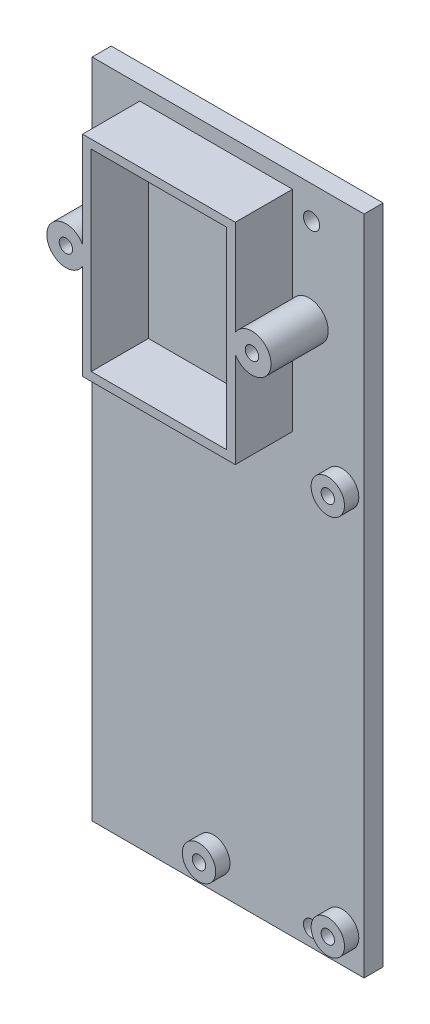
ISO-10303-21;
HEADER;
FILE_DESCRIPTION(('STEP AP214'),'2;1');
FILE_NAME('part.step','',(''),(''),'','','');
FILE_SCHEMA(('AUTOMOTIVE_DESIGN { 1 0 10303 214 1 1 1 1 }'));
ENDSEC;
DATA;
#1=APPLICATION_CONTEXT('core data for automotive mechanical design processes');
#2=APPLICATION_PROTOCOL_DEFINITION('international standard','automotive_design',2000,#1);
#3=PRODUCT_CONTEXT('',#1,'mechanical');
#4=PRODUCT('Part','Part','',(#3));
#5=PRODUCT_RELATED_PRODUCT_CATEGORY('part','',(#4));
#6=PRODUCT_DEFINITION_FORMATION('','',#4);
#7=PRODUCT_DEFINITION_CONTEXT('part definition',#1,'design');
#8=PRODUCT_DEFINITION('design','',#6,#7);
#9=PRODUCT_DEFINITION_SHAPE('','',#8);
#10=(LENGTH_UNIT() NAMED_UNIT(*) SI_UNIT(.MILLI.,.METRE.));
#11=(NAMED_UNIT(*) PLANE_ANGLE_UNIT() SI_UNIT($,.RADIAN.));
#12=(NAMED_UNIT(*) SI_UNIT($,.STERADIAN.) SOLID_ANGLE_UNIT());
#13=UNCERTAINTY_MEASURE_WITH_UNIT(LENGTH_MEASURE(1.E-05),#10,'distance_accuracy_value','');
#14=(GEOMETRIC_REPRESENTATION_CONTEXT(3) GLOBAL_UNCERTAINTY_ASSIGNED_CONTEXT((#13)) GLOBAL_UNIT_ASSIGNED_CONTEXT((#10,
#11,#12)) REPRESENTATION_CONTEXT('',''));
#15=CARTESIAN_POINT('',(0.,0.,0.));
#16=DIRECTION('',(0.,0.,1.));
#17=DIRECTION('',(1.,0.,0.));
#18=AXIS2_PLACEMENT_3D('',#15,#16,#17);
#19=CARTESIAN_POINT('',(-204.,-67.7,399.));
#20=DIRECTION('',(0.,1.,0.));
#21=DIRECTION('',(1.,0.,0.));
#22=AXIS2_PLACEMENT_3D('',#19,#20,#21);
#23=PLANE('',#22);
#24=DIRECTION('',(0.,0.,1.));
#25=VECTOR('',#24,1.);
#26=CARTESIAN_POINT('',(-147.,-67.7,399.));
#27=LINE('',#26,#25);
#28=CARTESIAN_POINT('',(-147.,-67.7,399.));
#29=VERTEX_POINT('',#28);
#30=CARTESIAN_POINT('',(-147.,-67.7,403.));
#31=VERTEX_POINT('',#30);
#32=EDGE_CURVE('E342',#29,#31,#27,.T.);
#33=ORIENTED_EDGE('',*,*,#32,.T.);
#34=DIRECTION('',(1.,0.,0.));
#35=VECTOR('',#34,1.);
#36=CARTESIAN_POINT('',(-204.,-67.7,403.));
#37=LINE('',#36,#35);
#38=CARTESIAN_POINT('',(-204.,-67.7,403.));
#39=VERTEX_POINT('',#38);
#40=EDGE_CURVE('E9',#39,#31,#37,.T.);
#41=ORIENTED_EDGE('',*,*,#40,.F.);
#42=DIRECTION('',(0.,0.,1.));
#43=VECTOR('',#42,1.);
#44=CARTESIAN_POINT('',(-204.,-67.7,399.));
#45=LINE('',#44,#43);
#46=CARTESIAN_POINT('',(-204.,-67.7,399.));
#47=VERTEX_POINT('',#46);
#48=EDGE_CURVE('E330',#47,#39,#45,.T.);
#49=ORIENTED_EDGE('',*,*,#48,.F.);
#50=DIRECTION('',(1.,0.,0.));
#51=VECTOR('',#50,1.);
#52=CARTESIAN_POINT('',(-204.,-67.7,399.));
#53=LINE('',#52,#51);
#54=EDGE_CURVE('E379',#47,#29,#53,.T.);
#55=ORIENTED_EDGE('',*,*,#54,.T.);
#56=EDGE_LOOP('',(#33,#41,#49,#55));
#57=FACE_BOUND('',#56,.T.);
#58=ADVANCED_FACE('F14',(#57),#23,.F.);
#59=CARTESIAN_POINT('',(-204.,-67.7,403.));
#60=DIRECTION('',(0.,0.,1.));
#61=DIRECTION('',(1.,0.,0.));
#62=AXIS2_PLACEMENT_3D('',#59,#60,#61);
#63=PLANE('',#62);
#64=CARTESIAN_POINT('',(-158.,64.2,403.));
#65=DIRECTION('',(0.,0.,1.));
#66=DIRECTION('',(1.,0.,0.));
#67=AXIS2_PLACEMENT_3D('',#64,#65,#66);
#68=CIRCLE('',#67,1.7);
#69=CARTESIAN_POINT('',(-156.3,64.2,403.));
#70=VERTEX_POINT('',#69);
#71=EDGE_CURVE('E361',#70,#70,#68,.T.);
#72=ORIENTED_EDGE('',*,*,#71,.F.);
#73=EDGE_LOOP('',(#72));
#74=FACE_BOUND('',#73,.T.);
#75=CARTESIAN_POINT('',(-151.6,19.,403.));
#76=DIRECTION('',(0.,0.,1.));
#77=DIRECTION('',(1.,0.,0.));
#78=AXIS2_PLACEMENT_3D('',#75,#76,#77);
#79=CIRCLE('',#78,3.5);
#80=CARTESIAN_POINT('',(-148.1,19.,403.));
#81=VERTEX_POINT('',#80);
#82=EDGE_CURVE('E475',#81,#81,#79,.T.);
#83=ORIENTED_EDGE('',*,*,#82,.F.);
#84=EDGE_LOOP('',(#83));
#85=FACE_BOUND('',#84,.T.);
#86=DIRECTION('',(0.,1.,0.));
#87=VECTOR('',#86,1.);
#88=CARTESIAN_POINT('',(-162.,-21.85,403.));
#89=LINE('',#88,#87);
#90=CARTESIAN_POINT('',(-162.,24.,403.));
#91=VERTEX_POINT('',#90);
#92=CARTESIAN_POINT('',(-162.,44.063508326896,403.));
#93=VERTEX_POINT('',#92);
#94=EDGE_CURVE('E482',#91,#93,#89,.T.);
#95=ORIENTED_EDGE('',*,*,#94,.F.);
#96=DIRECTION('',(-1.,0.,0.));
#97=VECTOR('',#96,1.);
#98=CARTESIAN_POINT('',(-199.,24.,403.));
#99=LINE('',#98,#97);
#100=CARTESIAN_POINT('',(-194.,24.,403.));
#101=VERTEX_POINT('',#100);
#102=EDGE_CURVE('E411',#91,#101,#99,.T.);
#103=ORIENTED_EDGE('',*,*,#102,.T.);
#104=DIRECTION('',(0.,1.,0.));
#105=VECTOR('',#104,1.);
#106=CARTESIAN_POINT('',(-194.,-21.85,403.));
#107=LINE('',#106,#105);
#108=CARTESIAN_POINT('',(-194.,44.063508326896,403.));
#109=VERTEX_POINT('',#108);
#110=EDGE_CURVE('E406',#101,#109,#107,.T.);
#111=ORIENTED_EDGE('',*,*,#110,.T.);
#112=CARTESIAN_POINT('',(-197.5,46.,403.));
#113=DIRECTION('',(0.,0.,1.));
#114=DIRECTION('',(1.,0.,0.));
#115=AXIS2_PLACEMENT_3D('',#112,#113,#114);
#116=CIRCLE('',#115,4.);
#117=CARTESIAN_POINT('',(-194.,47.936491673104,403.));
#118=VERTEX_POINT('',#117);
#119=EDGE_CURVE('E428',#118,#109,#116,.T.);
#120=ORIENTED_EDGE('',*,*,#119,.F.);
#121=DIRECTION('',(0.,1.,0.));
#122=VECTOR('',#121,1.);
#123=CARTESIAN_POINT('',(-194.,-21.85,403.));
#124=LINE('',#123,#122);
#125=CARTESIAN_POINT('',(-194.,68.,403.));
#126=VERTEX_POINT('',#125);
#127=EDGE_CURVE('E400',#118,#126,#124,.T.);
#128=ORIENTED_EDGE('',*,*,#127,.T.);
#129=DIRECTION('',(-1.,0.,0.));
#130=VECTOR('',#129,1.);
#131=CARTESIAN_POINT('',(-199.,68.,403.));
#132=LINE('',#131,#130);
#133=CARTESIAN_POINT('',(-162.,68.,403.));
#134=VERTEX_POINT('',#133);
#135=EDGE_CURVE('E291',#134,#126,#132,.T.);
#136=ORIENTED_EDGE('',*,*,#135,.F.);
#137=DIRECTION('',(0.,1.,0.));
#138=VECTOR('',#137,1.);
#139=CARTESIAN_POINT('',(-162.,-21.85,403.));
#140=LINE('',#139,#138);
#141=CARTESIAN_POINT('',(-162.,47.936491673104,403.));
#142=VERTEX_POINT('',#141);
#143=EDGE_CURVE('E363',#142,#134,#140,.T.);
#144=ORIENTED_EDGE('',*,*,#143,.F.);
#145=CARTESIAN_POINT('',(-158.5,46.,403.));
#146=DIRECTION('',(0.,0.,-1.));
#147=DIRECTION('',(-0.874999999999969,0.484122918275983,0.));
#148=AXIS2_PLACEMENT_3D('',#145,#146,#147);
#149=CIRCLE('',#148,4.);
#150=EDGE_CURVE('E414',#142,#93,#149,.T.);
#151=ORIENTED_EDGE('',*,*,#150,.T.);
#152=EDGE_LOOP('',(#95,#103,#111,#120,#128,#136,#144,#151));
#153=FACE_BOUND('',#152,.T.);
#154=CARTESIAN_POINT('',(-178.6,19.,403.));
#155=DIRECTION('',(0.,0.,1.));
#156=DIRECTION('',(1.,0.,0.));
#157=AXIS2_PLACEMENT_3D('',#154,#155,#156);
#158=CIRCLE('',#157,3.5);
#159=CARTESIAN_POINT('',(-175.1,19.,403.));
#160=VERTEX_POINT('',#159);
#161=EDGE_CURVE('E351',#160,#160,#158,.T.);
#162=ORIENTED_EDGE('',*,*,#161,.F.);
#163=EDGE_LOOP('',(#162));
#164=FACE_BOUND('',#163,.T.);
#165=CARTESIAN_POINT('',(-151.6,-61.,403.));
#166=DIRECTION('',(0.,0.,1.));
#167=DIRECTION('',(1.,0.,0.));
#168=AXIS2_PLACEMENT_3D('',#165,#166,#167);
#169=CIRCLE('',#168,3.5);
#170=CARTESIAN_POINT('',(-148.1,-61.,403.));
#171=VERTEX_POINT('',#170);
#172=EDGE_CURVE('E329',#171,#171,#169,.T.);
#173=ORIENTED_EDGE('',*,*,#172,.F.);
#174=EDGE_LOOP('',(#173));
#175=FACE_BOUND('',#174,.T.);
#176=CARTESIAN_POINT('',(-158.,-64.2,403.));
#177=DIRECTION('',(0.,0.,1.));
#178=DIRECTION('',(1.,0.,0.));
#179=AXIS2_PLACEMENT_3D('',#176,#177,#178);
#180=CIRCLE('',#179,1.7);
#181=CARTESIAN_POINT('',(-156.3,-64.2,403.));
#182=VERTEX_POINT('',#181);
#183=EDGE_CURVE('E328',#182,#182,#180,.T.);
#184=ORIENTED_EDGE('',*,*,#183,.F.);
#185=EDGE_LOOP('',(#184));
#186=FACE_BOUND('',#185,.T.);
#187=CARTESIAN_POINT('',(-178.6,-61.,403.));
#188=DIRECTION('',(0.,0.,1.));
#189=DIRECTION('',(1.,0.,0.));
#190=AXIS2_PLACEMENT_3D('',#187,#188,#189);
#191=CIRCLE('',#190,3.5);
#192=CARTESIAN_POINT('',(-175.1,-61.,403.));
#193=VERTEX_POINT('',#192);
#194=EDGE_CURVE('E497',#193,#193,#191,.T.);
#195=ORIENTED_EDGE('',*,*,#194,.F.);
#196=EDGE_LOOP('',(#195));
#197=FACE_BOUND('',#196,.T.);
#198=DIRECTION('',(0.,1.,0.));
#199=VECTOR('',#198,1.);
#200=CARTESIAN_POINT('',(-204.,-67.7,403.));
#201=LINE('',#200,#199);
#202=CARTESIAN_POINT('',(-204.,71.,403.));
#203=VERTEX_POINT('',#202);
#204=EDGE_CURVE('E352',#39,#203,#201,.T.);
#205=ORIENTED_EDGE('',*,*,#204,.F.);
#206=ORIENTED_EDGE('',*,*,#40,.T.);
#207=DIRECTION('',(0.,1.,0.));
#208=VECTOR('',#207,1.);
#209=CARTESIAN_POINT('',(-147.,-67.7,403.));
#210=LINE('',#209,#208);
#211=CARTESIAN_POINT('',(-147.,71.,403.));
#212=VERTEX_POINT('',#211);
#213=EDGE_CURVE('E302',#31,#212,#210,.T.);
#214=ORIENTED_EDGE('',*,*,#213,.T.);
#215=DIRECTION('',(1.,0.,0.));
#216=VECTOR('',#215,1.);
#217=CARTESIAN_POINT('',(-204.,71.,403.));
#218=LINE('',#217,#216);
#219=EDGE_CURVE('E25',#203,#212,#218,.T.);
#220=ORIENTED_EDGE('',*,*,#219,.F.);
#221=EDGE_LOOP('',(#205,#206,#214,#220));
#222=FACE_BOUND('',#221,.T.);
#223=ADVANCED_FACE('F596',(#74,#85,#153,#164,#175,#186,#197,#222),#63,.T.);
#224=CARTESIAN_POINT('',(-204.,71.,399.));
#225=DIRECTION('',(0.,1.,0.));
#226=DIRECTION('',(1.,0.,0.));
#227=AXIS2_PLACEMENT_3D('',#224,#225,#226);
#228=PLANE('',#227);
#229=DIRECTION('',(1.,0.,0.));
#230=VECTOR('',#229,1.);
#231=CARTESIAN_POINT('',(-204.,71.,399.));
#232=LINE('',#231,#230);
#233=CARTESIAN_POINT('',(-204.,71.,399.));
#234=VERTEX_POINT('',#233);
#235=CARTESIAN_POINT('',(-147.,71.,399.));
#236=VERTEX_POINT('',#235);
#237=EDGE_CURVE('E334',#234,#236,#232,.T.);
#238=ORIENTED_EDGE('',*,*,#237,.F.);
#239=DIRECTION('',(0.,0.,1.));
#240=VECTOR('',#239,1.);
#241=CARTESIAN_POINT('',(-204.,71.,399.));
#242=LINE('',#241,#240);
#243=EDGE_CURVE('E356',#234,#203,#242,.T.);
#244=ORIENTED_EDGE('',*,*,#243,.T.);
#245=ORIENTED_EDGE('',*,*,#219,.T.);
#246=DIRECTION('',(0.,0.,1.));
#247=VECTOR('',#246,1.);
#248=CARTESIAN_POINT('',(-147.,71.,399.));
#249=LINE('',#248,#247);
#250=EDGE_CURVE('E304',#236,#212,#249,.T.);
#251=ORIENTED_EDGE('',*,*,#250,.F.);
#252=EDGE_LOOP('',(#238,#244,#245,#251));
#253=FACE_BOUND('',#252,.T.);
#254=ADVANCED_FACE('F591',(#253),#228,.T.);
#255=CARTESIAN_POINT('',(-147.,-67.7,399.));
#256=DIRECTION('',(1.,0.,0.));
#257=DIRECTION('',(0.,1.,0.));
#258=AXIS2_PLACEMENT_3D('',#255,#256,#257);
#259=PLANE('',#258);
#260=ORIENTED_EDGE('',*,*,#32,.F.);
#261=DIRECTION('',(0.,1.,0.));
#262=VECTOR('',#261,1.);
#263=CARTESIAN_POINT('',(-147.,-67.7,399.));
#264=LINE('',#263,#262);
#265=EDGE_CURVE('E388',#29,#236,#264,.T.);
#266=ORIENTED_EDGE('',*,*,#265,.T.);
#267=ORIENTED_EDGE('',*,*,#250,.T.);
#268=ORIENTED_EDGE('',*,*,#213,.F.);
#269=EDGE_LOOP('',(#260,#266,#267,#268));
#270=FACE_BOUND('',#269,.T.);
#271=ADVANCED_FACE('F585',(#270),#259,.T.);
#272=CARTESIAN_POINT('',(-178.6,-61.,402.5));
#273=DIRECTION('',(0.,0.,1.));
#274=DIRECTION('',(1.,0.,0.));
#275=AXIS2_PLACEMENT_3D('',#272,#273,#274);
#276=CYLINDRICAL_SURFACE('',#275,3.5);
#277=DIRECTION('',(0.,0.,1.));
#278=VECTOR('',#277,1.);
#279=CARTESIAN_POINT('',(-175.1,-61.,402.5));
#280=LINE('',#279,#278);
#281=CARTESIAN_POINT('',(-175.1,-61.,406.));
#282=VERTEX_POINT('',#281);
#283=EDGE_CURVE('E458',#193,#282,#280,.T.);
#284=ORIENTED_EDGE('',*,*,#283,.T.);
#285=CARTESIAN_POINT('',(-178.6,-61.,406.));
#286=DIRECTION('',(0.,0.,1.));
#287=DIRECTION('',(1.,0.,0.));
#288=AXIS2_PLACEMENT_3D('',#285,#286,#287);
#289=CIRCLE('',#288,3.5);
#290=EDGE_CURVE('E455',#282,#282,#289,.T.);
#291=ORIENTED_EDGE('',*,*,#290,.F.);
#292=ORIENTED_EDGE('',*,*,#283,.F.);
#293=ORIENTED_EDGE('',*,*,#194,.T.);
#294=EDGE_LOOP('',(#284,#291,#292,#293));
#295=FACE_BOUND('',#294,.T.);
#296=ADVANCED_FACE('F581',(#295),#276,.T.);
#297=CARTESIAN_POINT('',(-178.6,-61.,406.));
#298=DIRECTION('',(0.,0.,1.));
#299=DIRECTION('',(1.,0.,0.));
#300=AXIS2_PLACEMENT_3D('',#297,#298,#299);
#301=PLANE('',#300);
#302=CARTESIAN_POINT('',(-178.6,-61.,406.));
#303=DIRECTION('',(0.,0.,1.));
#304=DIRECTION('',(1.,0.,0.));
#305=AXIS2_PLACEMENT_3D('',#302,#303,#304);
#306=CIRCLE('',#305,1.4);
#307=CARTESIAN_POINT('',(-177.2,-61.,406.));
#308=VERTEX_POINT('',#307);
#309=EDGE_CURVE('E459',#308,#308,#306,.T.);
#310=ORIENTED_EDGE('',*,*,#309,.F.);
#311=EDGE_LOOP('',(#310));
#312=FACE_BOUND('',#311,.T.);
#313=ORIENTED_EDGE('',*,*,#290,.T.);
#314=EDGE_LOOP('',(#313));
#315=FACE_BOUND('',#314,.T.);
#316=ADVANCED_FACE('F578',(#312,#315),#301,.T.);
#317=CARTESIAN_POINT('',(-178.6,-61.,398.9));
#318=DIRECTION('',(0.,0.,1.));
#319=DIRECTION('',(1.,0.,0.));
#320=AXIS2_PLACEMENT_3D('',#317,#318,#319);
#321=CYLINDRICAL_SURFACE('',#320,1.4);
#322=DIRECTION('',(0.,0.,1.));
#323=VECTOR('',#322,1.);
#324=CARTESIAN_POINT('',(-177.2,-61.,398.9));
#325=LINE('',#324,#323);
#326=CARTESIAN_POINT('',(-177.2,-61.,399.));
#327=VERTEX_POINT('',#326);
#328=EDGE_CURVE('E545',#327,#308,#325,.T.);
#329=ORIENTED_EDGE('',*,*,#328,.F.);
#330=CARTESIAN_POINT('',(-178.6,-61.,399.));
#331=DIRECTION('',(0.,0.,1.));
#332=DIRECTION('',(1.,0.,0.));
#333=AXIS2_PLACEMENT_3D('',#330,#331,#332);
#334=CIRCLE('',#333,1.4);
#335=EDGE_CURVE('E286',#327,#327,#334,.T.);
#336=ORIENTED_EDGE('',*,*,#335,.F.);
#337=ORIENTED_EDGE('',*,*,#328,.T.);
#338=ORIENTED_EDGE('',*,*,#309,.T.);
#339=EDGE_LOOP('',(#329,#336,#337,#338));
#340=FACE_BOUND('',#339,.T.);
#341=ADVANCED_FACE('F573',(#340),#321,.F.);
#342=CARTESIAN_POINT('',(-158.,-64.2,398.9));
#343=DIRECTION('',(0.,0.,1.));
#344=DIRECTION('',(1.,0.,0.));
#345=AXIS2_PLACEMENT_3D('',#342,#343,#344);
#346=CYLINDRICAL_SURFACE('',#345,1.7);
#347=DIRECTION('',(0.,0.,1.));
#348=VECTOR('',#347,1.);
#349=CARTESIAN_POINT('',(-156.3,-64.2,398.9));
#350=LINE('',#349,#348);
#351=CARTESIAN_POINT('',(-156.3,-64.2,399.));
#352=VERTEX_POINT('',#351);
#353=EDGE_CURVE('E324',#352,#182,#350,.T.);
#354=ORIENTED_EDGE('',*,*,#353,.F.);
#355=CARTESIAN_POINT('',(-158.,-64.2,399.));
#356=DIRECTION('',(0.,0.,1.));
#357=DIRECTION('',(1.,0.,0.));
#358=AXIS2_PLACEMENT_3D('',#355,#356,#357);
#359=CIRCLE('',#358,1.7);
#360=EDGE_CURVE('E281',#352,#352,#359,.T.);
#361=ORIENTED_EDGE('',*,*,#360,.F.);
#362=ORIENTED_EDGE('',*,*,#353,.T.);
#363=ORIENTED_EDGE('',*,*,#183,.T.);
#364=EDGE_LOOP('',(#354,#361,#362,#363));
#365=FACE_BOUND('',#364,.T.);
#366=ADVANCED_FACE('F629',(#365),#346,.F.);
#367=CARTESIAN_POINT('',(-151.6,-61.,402.5));
#368=DIRECTION('',(0.,0.,1.));
#369=DIRECTION('',(1.,0.,0.));
#370=AXIS2_PLACEMENT_3D('',#367,#368,#369);
#371=CYLINDRICAL_SURFACE('',#370,3.5);
#372=DIRECTION('',(0.,0.,1.));
#373=VECTOR('',#372,1.);
#374=CARTESIAN_POINT('',(-148.1,-61.,402.5));
#375=LINE('',#374,#373);
#376=CARTESIAN_POINT('',(-148.1,-61.,406.));
#377=VERTEX_POINT('',#376);
#378=EDGE_CURVE('E468',#171,#377,#375,.T.);
#379=ORIENTED_EDGE('',*,*,#378,.T.);
#380=CARTESIAN_POINT('',(-151.6,-61.,406.));
#381=DIRECTION('',(0.,0.,1.));
#382=DIRECTION('',(1.,0.,0.));
#383=AXIS2_PLACEMENT_3D('',#380,#381,#382);
#384=CIRCLE('',#383,3.5);
#385=EDGE_CURVE('E471',#377,#377,#384,.T.);
#386=ORIENTED_EDGE('',*,*,#385,.F.);
#387=ORIENTED_EDGE('',*,*,#378,.F.);
#388=ORIENTED_EDGE('',*,*,#172,.T.);
#389=EDGE_LOOP('',(#379,#386,#387,#388));
#390=FACE_BOUND('',#389,.T.);
#391=ADVANCED_FACE('F783',(#390),#371,.T.);
#392=CARTESIAN_POINT('',(-151.6,-61.,406.));
#393=DIRECTION('',(0.,0.,1.));
#394=DIRECTION('',(1.,0.,0.));
#395=AXIS2_PLACEMENT_3D('',#392,#393,#394);
#396=PLANE('',#395);
#397=CARTESIAN_POINT('',(-151.6,-61.,406.));
#398=DIRECTION('',(0.,0.,1.));
#399=DIRECTION('',(1.,0.,0.));
#400=AXIS2_PLACEMENT_3D('',#397,#398,#399);
#401=CIRCLE('',#400,1.4);
#402=CARTESIAN_POINT('',(-150.2,-61.,406.));
#403=VERTEX_POINT('',#402);
#404=EDGE_CURVE('E350',#403,#403,#401,.T.);
#405=ORIENTED_EDGE('',*,*,#404,.F.);
#406=EDGE_LOOP('',(#405));
#407=FACE_BOUND('',#406,.T.);
#408=ORIENTED_EDGE('',*,*,#385,.T.);
#409=EDGE_LOOP('',(#408));
#410=FACE_BOUND('',#409,.T.);
#411=ADVANCED_FACE('F16',(#407,#410),#396,.T.);
#412=CARTESIAN_POINT('',(-151.6,-61.,398.9));
#413=DIRECTION('',(0.,0.,1.));
#414=DIRECTION('',(1.,0.,0.));
#415=AXIS2_PLACEMENT_3D('',#412,#413,#414);
#416=CYLINDRICAL_SURFACE('',#415,1.4);
#417=DIRECTION('',(0.,0.,1.));
#418=VECTOR('',#417,1.);
#419=CARTESIAN_POINT('',(-150.2,-61.,398.9));
#420=LINE('',#419,#418);
#421=CARTESIAN_POINT('',(-150.2,-61.,399.));
#422=VERTEX_POINT('',#421);
#423=EDGE_CURVE('E346',#422,#403,#420,.T.);
#424=ORIENTED_EDGE('',*,*,#423,.F.);
#425=CARTESIAN_POINT('',(-151.6,-61.,399.));
#426=DIRECTION('',(0.,0.,1.));
#427=DIRECTION('',(1.,0.,0.));
#428=AXIS2_PLACEMENT_3D('',#425,#426,#427);
#429=CIRCLE('',#428,1.4);
#430=EDGE_CURVE('E285',#422,#422,#429,.T.);
#431=ORIENTED_EDGE('',*,*,#430,.F.);
#432=ORIENTED_EDGE('',*,*,#423,.T.);
#433=ORIENTED_EDGE('',*,*,#404,.T.);
#434=EDGE_LOOP('',(#424,#431,#432,#433));
#435=FACE_BOUND('',#434,.T.);
#436=ADVANCED_FACE('F774',(#435),#416,.F.);
#437=CARTESIAN_POINT('',(-178.6,19.,402.5));
#438=DIRECTION('',(0.,0.,1.));
#439=DIRECTION('',(1.,0.,0.));
#440=AXIS2_PLACEMENT_3D('',#437,#438,#439);
#441=CYLINDRICAL_SURFACE('',#440,3.5);
#442=DIRECTION('',(0.,0.,1.));
#443=VECTOR('',#442,1.);
#444=CARTESIAN_POINT('',(-175.1,19.,402.5));
#445=LINE('',#444,#443);
#446=CARTESIAN_POINT('',(-175.1,19.,406.));
#447=VERTEX_POINT('',#446);
#448=EDGE_CURVE('E438',#160,#447,#445,.T.);
#449=ORIENTED_EDGE('',*,*,#448,.T.);
#450=CARTESIAN_POINT('',(-178.6,19.,406.));
#451=DIRECTION('',(0.,0.,1.));
#452=DIRECTION('',(1.,0.,0.));
#453=AXIS2_PLACEMENT_3D('',#450,#451,#452);
#454=CIRCLE('',#453,3.5);
#455=EDGE_CURVE('E435',#447,#447,#454,.T.);
#456=ORIENTED_EDGE('',*,*,#455,.F.);
#457=ORIENTED_EDGE('',*,*,#448,.F.);
#458=ORIENTED_EDGE('',*,*,#161,.T.);
#459=EDGE_LOOP('',(#449,#456,#457,#458));
#460=FACE_BOUND('',#459,.T.);
#461=ADVANCED_FACE('F771',(#460),#441,.T.);
#462=CARTESIAN_POINT('',(-178.6,19.,406.));
#463=DIRECTION('',(0.,0.,1.));
#464=DIRECTION('',(1.,0.,0.));
#465=AXIS2_PLACEMENT_3D('',#462,#463,#464);
#466=PLANE('',#465);
#467=CARTESIAN_POINT('',(-178.6,19.,406.));
#468=DIRECTION('',(0.,0.,1.));
#469=DIRECTION('',(1.,0.,0.));
#470=AXIS2_PLACEMENT_3D('',#467,#468,#469);
#471=CIRCLE('',#470,1.4);
#472=CARTESIAN_POINT('',(-177.2,19.,406.));
#473=VERTEX_POINT('',#472);
#474=EDGE_CURVE('E439',#473,#473,#471,.T.);
#475=ORIENTED_EDGE('',*,*,#474,.F.);
#476=EDGE_LOOP('',(#475));
#477=FACE_BOUND('',#476,.T.);
#478=ORIENTED_EDGE('',*,*,#455,.T.);
#479=EDGE_LOOP('',(#478));
#480=FACE_BOUND('',#479,.T.);
#481=ADVANCED_FACE('F661',(#477,#480),#466,.T.);
#482=CARTESIAN_POINT('',(-178.6,19.,398.9));
#483=DIRECTION('',(0.,0.,1.));
#484=DIRECTION('',(1.,0.,0.));
#485=AXIS2_PLACEMENT_3D('',#482,#483,#484);
#486=CYLINDRICAL_SURFACE('',#485,1.4);
#487=DIRECTION('',(0.,0.,1.));
#488=VECTOR('',#487,1.);
#489=CARTESIAN_POINT('',(-177.2,19.,398.9));
#490=LINE('',#489,#488);
#491=CARTESIAN_POINT('',(-177.2,19.,399.));
#492=VERTEX_POINT('',#491);
#493=EDGE_CURVE('E18',#492,#473,#490,.T.);
#494=ORIENTED_EDGE('',*,*,#493,.F.);
#495=CARTESIAN_POINT('',(-178.6,19.,399.));
#496=DIRECTION('',(0.,0.,1.));
#497=DIRECTION('',(1.,0.,0.));
#498=AXIS2_PLACEMENT_3D('',#495,#496,#497);
#499=CIRCLE('',#498,1.4);
#500=EDGE_CURVE('E314',#492,#492,#499,.T.);
#501=ORIENTED_EDGE('',*,*,#500,.F.);
#502=ORIENTED_EDGE('',*,*,#493,.T.);
#503=ORIENTED_EDGE('',*,*,#474,.T.);
#504=EDGE_LOOP('',(#494,#501,#502,#503));
#505=FACE_BOUND('',#504,.T.);
#506=ADVANCED_FACE('F654',(#505),#486,.F.);
#507=CARTESIAN_POINT('',(-197.5,46.,407.05));
#508=DIRECTION('',(0.,0.,-1.));
#509=DIRECTION('',(-1.,0.,0.));
#510=AXIS2_PLACEMENT_3D('',#507,#508,#509);
#511=CYLINDRICAL_SURFACE('',#510,1.4);
#512=DIRECTION('',(0.,0.,-1.));
#513=VECTOR('',#512,1.);
#514=CARTESIAN_POINT('',(-198.9,46.,407.05));
#515=LINE('',#514,#513);
#516=CARTESIAN_POINT('',(-198.9,46.,406.9));
#517=VERTEX_POINT('',#516);
#518=CARTESIAN_POINT('',(-198.9,46.,399.));
#519=VERTEX_POINT('',#518);
#520=EDGE_CURVE('E301',#517,#519,#515,.T.);
#521=ORIENTED_EDGE('',*,*,#520,.F.);
#522=CARTESIAN_POINT('',(-197.5,46.,406.9));
#523=DIRECTION('',(0.,0.,1.));
#524=DIRECTION('',(1.,0.,0.));
#525=AXIS2_PLACEMENT_3D('',#522,#523,#524);
#526=CIRCLE('',#525,1.4);
#527=CARTESIAN_POINT('',(-196.1,46.,406.9));
#528=VERTEX_POINT('',#527);
#529=EDGE_CURVE('E297',#528,#517,#526,.T.);
#530=ORIENTED_EDGE('',*,*,#529,.F.);
#531=DIRECTION('',(0.,0.,-1.));
#532=VECTOR('',#531,1.);
#533=CARTESIAN_POINT('',(-196.1,46.,415.));
#534=LINE('',#533,#532);
#535=CARTESIAN_POINT('',(-196.1,46.,415.));
#536=VERTEX_POINT('',#535);
#537=EDGE_CURVE('E300',#536,#528,#534,.T.);
#538=ORIENTED_EDGE('',*,*,#537,.F.);
#539=CARTESIAN_POINT('',(-197.5,46.,415.));
#540=DIRECTION('',(0.,0.,1.));
#541=DIRECTION('',(1.,0.,0.));
#542=AXIS2_PLACEMENT_3D('',#539,#540,#541);
#543=CIRCLE('',#542,1.4);
#544=EDGE_CURVE('E308',#536,#536,#543,.T.);
#545=ORIENTED_EDGE('',*,*,#544,.T.);
#546=ORIENTED_EDGE('',*,*,#537,.T.);
#547=ORIENTED_EDGE('',*,*,#529,.T.);
#548=ORIENTED_EDGE('',*,*,#520,.T.);
#549=CARTESIAN_POINT('',(-197.5,46.,399.));
#550=DIRECTION('',(0.,0.,-1.));
#551=DIRECTION('',(-1.,0.,0.));
#552=AXIS2_PLACEMENT_3D('',#549,#550,#551);
#553=CIRCLE('',#552,1.4);
#554=EDGE_CURVE('E309',#519,#519,#553,.T.);
#555=ORIENTED_EDGE('',*,*,#554,.T.);
#556=EDGE_LOOP('',(#521,#530,#538,#545,#546,#547,#548,#555));
#557=FACE_BOUND('',#556,.T.);
#558=ADVANCED_FACE('F651',(#557),#511,.F.);
#559=CARTESIAN_POINT('',(-151.6,19.,402.5));
#560=DIRECTION('',(0.,0.,1.));
#561=DIRECTION('',(1.,0.,0.));
#562=AXIS2_PLACEMENT_3D('',#559,#560,#561);
#563=CYLINDRICAL_SURFACE('',#562,3.5);
#564=DIRECTION('',(0.,0.,1.));
#565=VECTOR('',#564,1.);
#566=CARTESIAN_POINT('',(-148.1,19.,402.5));
#567=LINE('',#566,#565);
#568=CARTESIAN_POINT('',(-148.1,19.,406.));
#569=VERTEX_POINT('',#568);
#570=EDGE_CURVE('E418',#81,#569,#567,.T.);
#571=ORIENTED_EDGE('',*,*,#570,.T.);
#572=CARTESIAN_POINT('',(-151.6,19.,406.));
#573=DIRECTION('',(0.,0.,1.));
#574=DIRECTION('',(1.,0.,0.));
#575=AXIS2_PLACEMENT_3D('',#572,#573,#574);
#576=CIRCLE('',#575,3.5);
#577=EDGE_CURVE('E415',#569,#569,#576,.T.);
#578=ORIENTED_EDGE('',*,*,#577,.F.);
#579=ORIENTED_EDGE('',*,*,#570,.F.);
#580=ORIENTED_EDGE('',*,*,#82,.T.);
#581=EDGE_LOOP('',(#571,#578,#579,#580));
#582=FACE_BOUND('',#581,.T.);
#583=ADVANCED_FACE('F620',(#582),#563,.T.);
#584=CARTESIAN_POINT('',(-151.6,19.,406.));
#585=DIRECTION('',(0.,0.,1.));
#586=DIRECTION('',(1.,0.,0.));
#587=AXIS2_PLACEMENT_3D('',#584,#585,#586);
#588=PLANE('',#587);
#589=CARTESIAN_POINT('',(-151.6,19.,406.));
#590=DIRECTION('',(0.,0.,1.));
#591=DIRECTION('',(1.,0.,0.));
#592=AXIS2_PLACEMENT_3D('',#589,#590,#591);
#593=CIRCLE('',#592,1.4);
#594=CARTESIAN_POINT('',(-150.2,19.,406.));
#595=VERTEX_POINT('',#594);
#596=EDGE_CURVE('E419',#595,#595,#593,.T.);
#597=ORIENTED_EDGE('',*,*,#596,.F.);
#598=EDGE_LOOP('',(#597));
#599=FACE_BOUND('',#598,.T.);
#600=ORIENTED_EDGE('',*,*,#577,.T.);
#601=EDGE_LOOP('',(#600));
#602=FACE_BOUND('',#601,.T.);
#603=ADVANCED_FACE('F617',(#599,#602),#588,.T.);
#604=CARTESIAN_POINT('',(-151.6,19.,398.9));
#605=DIRECTION('',(0.,0.,1.));
#606=DIRECTION('',(1.,0.,0.));
#607=AXIS2_PLACEMENT_3D('',#604,#605,#606);
#608=CYLINDRICAL_SURFACE('',#607,1.4);
#609=DIRECTION('',(0.,0.,1.));
#610=VECTOR('',#609,1.);
#611=CARTESIAN_POINT('',(-150.2,19.,398.9));
#612=LINE('',#611,#610);
#613=CARTESIAN_POINT('',(-150.2,19.,399.));
#614=VERTEX_POINT('',#613);
#615=EDGE_CURVE('E410',#614,#595,#612,.T.);
#616=ORIENTED_EDGE('',*,*,#615,.F.);
#617=CARTESIAN_POINT('',(-151.6,19.,399.));
#618=DIRECTION('',(0.,0.,1.));
#619=DIRECTION('',(1.,0.,0.));
#620=AXIS2_PLACEMENT_3D('',#617,#618,#619);
#621=CIRCLE('',#620,1.4);
#622=EDGE_CURVE('E313',#614,#614,#621,.T.);
#623=ORIENTED_EDGE('',*,*,#622,.F.);
#624=ORIENTED_EDGE('',*,*,#615,.T.);
#625=ORIENTED_EDGE('',*,*,#596,.T.);
#626=EDGE_LOOP('',(#616,#623,#624,#625));
#627=FACE_BOUND('',#626,.T.);
#628=ADVANCED_FACE('F605',(#627),#608,.F.);
#629=CARTESIAN_POINT('',(-194.,24.,402.5));
#630=DIRECTION('',(1.,0.,0.));
#631=DIRECTION('',(0.,1.,0.));
#632=AXIS2_PLACEMENT_3D('',#629,#630,#631);
#633=PLANE('',#632);
#634=DIRECTION('',(0.,1.,0.));
#635=VECTOR('',#634,1.);
#636=CARTESIAN_POINT('',(-194.,24.,415.));
#637=LINE('',#636,#635);
#638=CARTESIAN_POINT('',(-194.,24.,415.));
#639=VERTEX_POINT('',#638);
#640=CARTESIAN_POINT('',(-194.,44.063508326896,415.));
#641=VERTEX_POINT('',#640);
#642=EDGE_CURVE('E323',#639,#641,#637,.T.);
#643=ORIENTED_EDGE('',*,*,#642,.T.);
#644=DIRECTION('',(0.,0.,1.));
#645=VECTOR('',#644,1.);
#646=CARTESIAN_POINT('',(-194.,44.063508326896,402.5));
#647=LINE('',#646,#645);
#648=EDGE_CURVE('E135',#109,#641,#647,.T.);
#649=ORIENTED_EDGE('',*,*,#648,.F.);
#650=ORIENTED_EDGE('',*,*,#110,.F.);
#651=DIRECTION('',(0.,0.,1.));
#652=VECTOR('',#651,1.);
#653=CARTESIAN_POINT('',(-194.,24.,402.5));
#654=LINE('',#653,#652);
#655=EDGE_CURVE('E147',#101,#639,#654,.T.);
#656=ORIENTED_EDGE('',*,*,#655,.T.);
#657=EDGE_LOOP('',(#643,#649,#650,#656));
#658=FACE_BOUND('',#657,.T.);
#659=ADVANCED_FACE('F686',(#658),#633,.F.);
#660=CARTESIAN_POINT('',(-194.,24.,402.5));
#661=DIRECTION('',(0.,1.,0.));
#662=DIRECTION('',(1.,0.,0.));
#663=AXIS2_PLACEMENT_3D('',#660,#661,#662);
#664=PLANE('',#663);
#665=DIRECTION('',(1.,0.,0.));
#666=VECTOR('',#665,1.);
#667=CARTESIAN_POINT('',(-194.,24.,415.));
#668=LINE('',#667,#666);
#669=CARTESIAN_POINT('',(-162.,24.,415.));
#670=VERTEX_POINT('',#669);
#671=EDGE_CURVE('E280',#639,#670,#668,.T.);
#672=ORIENTED_EDGE('',*,*,#671,.F.);
#673=ORIENTED_EDGE('',*,*,#655,.F.);
#674=ORIENTED_EDGE('',*,*,#102,.F.);
#675=DIRECTION('',(0.,0.,1.));
#676=VECTOR('',#675,1.);
#677=CARTESIAN_POINT('',(-162.,24.,402.5));
#678=LINE('',#677,#676);
#679=EDGE_CURVE('E566',#91,#670,#678,.T.);
#680=ORIENTED_EDGE('',*,*,#679,.T.);
#681=EDGE_LOOP('',(#672,#673,#674,#680));
#682=FACE_BOUND('',#681,.T.);
#683=ADVANCED_FACE('F646',(#682),#664,.F.);
#684=CARTESIAN_POINT('',(-197.5,46.,402.5));
#685=DIRECTION('',(0.,0.,1.));
#686=DIRECTION('',(1.,0.,0.));
#687=AXIS2_PLACEMENT_3D('',#684,#685,#686);
#688=CYLINDRICAL_SURFACE('',#687,4.);
#689=CARTESIAN_POINT('',(-197.5,46.,415.));
#690=DIRECTION('',(0.,0.,1.));
#691=DIRECTION('',(1.,0.,0.));
#692=AXIS2_PLACEMENT_3D('',#689,#690,#691);
#693=CIRCLE('',#692,4.);
#694=CARTESIAN_POINT('',(-194.,47.936491673104,415.));
#695=VERTEX_POINT('',#694);
#696=EDGE_CURVE('E392',#695,#641,#693,.T.);
#697=ORIENTED_EDGE('',*,*,#696,.F.);
#698=DIRECTION('',(0.,0.,1.));
#699=VECTOR('',#698,1.);
#700=CARTESIAN_POINT('',(-194.,47.936491673104,402.5));
#701=LINE('',#700,#699);
#702=EDGE_CURVE('E404',#118,#695,#701,.T.);
#703=ORIENTED_EDGE('',*,*,#702,.F.);
#704=ORIENTED_EDGE('',*,*,#119,.T.);
#705=ORIENTED_EDGE('',*,*,#648,.T.);
#706=EDGE_LOOP('',(#697,#703,#704,#705));
#707=FACE_BOUND('',#706,.T.);
#708=ADVANCED_FACE('F642',(#707),#688,.T.);
#709=CARTESIAN_POINT('',(-162.,24.,402.5));
#710=DIRECTION('',(1.,0.,0.));
#711=DIRECTION('',(0.,1.,0.));
#712=AXIS2_PLACEMENT_3D('',#709,#710,#711);
#713=PLANE('',#712);
#714=ORIENTED_EDGE('',*,*,#679,.F.);
#715=ORIENTED_EDGE('',*,*,#94,.T.);
#716=DIRECTION('',(0.,0.,1.));
#717=VECTOR('',#716,1.);
#718=CARTESIAN_POINT('',(-162.,44.063508326896,402.5));
#719=LINE('',#718,#717);
#720=CARTESIAN_POINT('',(-162.,44.063508326896,415.));
#721=VERTEX_POINT('',#720);
#722=EDGE_CURVE('E405',#93,#721,#719,.T.);
#723=ORIENTED_EDGE('',*,*,#722,.T.);
#724=DIRECTION('',(0.,1.,0.));
#725=VECTOR('',#724,1.);
#726=CARTESIAN_POINT('',(-162.,24.,415.));
#727=LINE('',#726,#725);
#728=EDGE_CURVE('E276',#670,#721,#727,.T.);
#729=ORIENTED_EDGE('',*,*,#728,.F.);
#730=EDGE_LOOP('',(#714,#715,#723,#729));
#731=FACE_BOUND('',#730,.T.);
#732=ADVANCED_FACE('F639',(#731),#713,.T.);
#733=CARTESIAN_POINT('',(-194.,24.,402.5));
#734=DIRECTION('',(1.,0.,0.));
#735=DIRECTION('',(0.,1.,0.));
#736=AXIS2_PLACEMENT_3D('',#733,#734,#735);
#737=PLANE('',#736);
#738=DIRECTION('',(0.,1.,0.));
#739=VECTOR('',#738,1.);
#740=CARTESIAN_POINT('',(-194.,24.,415.));
#741=LINE('',#740,#739);
#742=CARTESIAN_POINT('',(-194.,68.,415.));
#743=VERTEX_POINT('',#742);
#744=EDGE_CURVE('E395',#695,#743,#741,.T.);
#745=ORIENTED_EDGE('',*,*,#744,.T.);
#746=DIRECTION('',(0.,0.,1.));
#747=VECTOR('',#746,1.);
#748=CARTESIAN_POINT('',(-194.,68.,402.5));
#749=LINE('',#748,#747);
#750=EDGE_CURVE('E295',#126,#743,#749,.T.);
#751=ORIENTED_EDGE('',*,*,#750,.F.);
#752=ORIENTED_EDGE('',*,*,#127,.F.);
#753=ORIENTED_EDGE('',*,*,#702,.T.);
#754=EDGE_LOOP('',(#745,#751,#752,#753));
#755=FACE_BOUND('',#754,.T.);
#756=ADVANCED_FACE('F520',(#755),#737,.F.);
#757=CARTESIAN_POINT('',(-158.5,46.,402.5));
#758=DIRECTION('',(0.,0.,1.));
#759=DIRECTION('',(1.,0.,0.));
#760=AXIS2_PLACEMENT_3D('',#757,#758,#759);
#761=CYLINDRICAL_SURFACE('',#760,4.);
#762=ORIENTED_EDGE('',*,*,#150,.F.);
#763=DIRECTION('',(0.,0.,1.));
#764=VECTOR('',#763,1.);
#765=CARTESIAN_POINT('',(-162.,47.936491673104,402.5));
#766=LINE('',#765,#764);
#767=CARTESIAN_POINT('',(-162.,47.936491673104,415.));
#768=VERTEX_POINT('',#767);
#769=EDGE_CURVE('E367',#142,#768,#766,.T.);
#770=ORIENTED_EDGE('',*,*,#769,.T.);
#771=CARTESIAN_POINT('',(-158.5,46.,415.));
#772=DIRECTION('',(0.,0.,-1.));
#773=DIRECTION('',(-0.874999999999969,0.484122918275983,0.));
#774=AXIS2_PLACEMENT_3D('',#771,#772,#773);
#775=CIRCLE('',#774,4.);
#776=EDGE_CURVE('E279',#768,#721,#775,.T.);
#777=ORIENTED_EDGE('',*,*,#776,.T.);
#778=ORIENTED_EDGE('',*,*,#722,.F.);
#779=EDGE_LOOP('',(#762,#770,#777,#778));
#780=FACE_BOUND('',#779,.T.);
#781=ADVANCED_FACE('F663',(#780),#761,.T.);
#782=CARTESIAN_POINT('',(-194.,68.,402.5));
#783=DIRECTION('',(0.,1.,0.));
#784=DIRECTION('',(1.,0.,0.));
#785=AXIS2_PLACEMENT_3D('',#782,#783,#784);
#786=PLANE('',#785);
#787=DIRECTION('',(0.,0.,1.));
#788=VECTOR('',#787,1.);
#789=CARTESIAN_POINT('',(-162.,68.,402.5));
#790=LINE('',#789,#788);
#791=CARTESIAN_POINT('',(-162.,68.,415.));
#792=VERTEX_POINT('',#791);
#793=EDGE_CURVE('E296',#134,#792,#790,.T.);
#794=ORIENTED_EDGE('',*,*,#793,.F.);
#795=ORIENTED_EDGE('',*,*,#135,.T.);
#796=ORIENTED_EDGE('',*,*,#750,.T.);
#797=DIRECTION('',(1.,0.,0.));
#798=VECTOR('',#797,1.);
#799=CARTESIAN_POINT('',(-194.,68.,415.));
#800=LINE('',#799,#798);
#801=EDGE_CURVE('E463',#743,#792,#800,.T.);
#802=ORIENTED_EDGE('',*,*,#801,.T.);
#803=EDGE_LOOP('',(#794,#795,#796,#802));
#804=FACE_BOUND('',#803,.T.);
#805=ADVANCED_FACE('F530',(#804),#786,.T.);
#806=CARTESIAN_POINT('',(-162.,24.,402.5));
#807=DIRECTION('',(1.,0.,0.));
#808=DIRECTION('',(0.,1.,0.));
#809=AXIS2_PLACEMENT_3D('',#806,#807,#808);
#810=PLANE('',#809);
#811=ORIENTED_EDGE('',*,*,#769,.F.);
#812=ORIENTED_EDGE('',*,*,#143,.T.);
#813=ORIENTED_EDGE('',*,*,#793,.T.);
#814=DIRECTION('',(0.,1.,0.));
#815=VECTOR('',#814,1.);
#816=CARTESIAN_POINT('',(-162.,24.,415.));
#817=LINE('',#816,#815);
#818=EDGE_CURVE('E290',#768,#792,#817,.T.);
#819=ORIENTED_EDGE('',*,*,#818,.F.);
#820=EDGE_LOOP('',(#811,#812,#813,#819));
#821=FACE_BOUND('',#820,.T.);
#822=ADVANCED_FACE('F615',(#821),#810,.T.);
#823=CARTESIAN_POINT('',(-192.2,25.8,403.));
#824=DIRECTION('',(0.,1.,0.));
#825=DIRECTION('',(1.,0.,0.));
#826=AXIS2_PLACEMENT_3D('',#823,#824,#825);
#827=PLANE('',#826);
#828=DIRECTION('',(0.,0.,1.));
#829=VECTOR('',#828,1.);
#830=CARTESIAN_POINT('',(-163.8,25.8,403.));
#831=LINE('',#830,#829);
#832=CARTESIAN_POINT('',(-163.8,25.8,403.));
#833=VERTEX_POINT('',#832);
#834=CARTESIAN_POINT('',(-163.8,25.8,415.));
#835=VERTEX_POINT('',#834);
#836=EDGE_CURVE('E254',#833,#835,#831,.T.);
#837=ORIENTED_EDGE('',*,*,#836,.F.);
#838=DIRECTION('',(1.,0.,0.));
#839=VECTOR('',#838,1.);
#840=CARTESIAN_POINT('',(-192.2,25.8,403.));
#841=LINE('',#840,#839);
#842=CARTESIAN_POINT('',(-192.2,25.8,403.));
#843=VERTEX_POINT('',#842);
#844=EDGE_CURVE('E380',#843,#833,#841,.T.);
#845=ORIENTED_EDGE('',*,*,#844,.F.);
#846=DIRECTION('',(0.,0.,1.));
#847=VECTOR('',#846,1.);
#848=CARTESIAN_POINT('',(-192.2,25.8,403.));
#849=LINE('',#848,#847);
#850=CARTESIAN_POINT('',(-192.2,25.8,415.));
#851=VERTEX_POINT('',#850);
#852=EDGE_CURVE('E399',#843,#851,#849,.T.);
#853=ORIENTED_EDGE('',*,*,#852,.T.);
#854=DIRECTION('',(-1.,0.,0.));
#855=VECTOR('',#854,1.);
#856=CARTESIAN_POINT('',(-193.1,25.8,415.));
#857=LINE('',#856,#855);
#858=EDGE_CURVE('E271',#835,#851,#857,.T.);
#859=ORIENTED_EDGE('',*,*,#858,.F.);
#860=EDGE_LOOP('',(#837,#845,#853,#859));
#861=FACE_BOUND('',#860,.T.);
#862=ADVANCED_FACE('F612',(#861),#827,.T.);
#863=CARTESIAN_POINT('',(-163.8,25.8,403.));
#864=DIRECTION('',(1.,0.,0.));
#865=DIRECTION('',(0.,1.,0.));
#866=AXIS2_PLACEMENT_3D('',#863,#864,#865);
#867=PLANE('',#866);
#868=DIRECTION('',(0.,1.,0.));
#869=VECTOR('',#868,1.);
#870=CARTESIAN_POINT('',(-163.8,24.9,415.));
#871=LINE('',#870,#869);
#872=CARTESIAN_POINT('',(-163.8,66.2,415.));
#873=VERTEX_POINT('',#872);
#874=EDGE_CURVE('E251',#835,#873,#871,.T.);
#875=ORIENTED_EDGE('',*,*,#874,.T.);
#876=DIRECTION('',(0.,0.,1.));
#877=VECTOR('',#876,1.);
#878=CARTESIAN_POINT('',(-163.8,66.2,403.));
#879=LINE('',#878,#877);
#880=CARTESIAN_POINT('',(-163.8,66.2,403.));
#881=VERTEX_POINT('',#880);
#882=EDGE_CURVE('E236',#881,#873,#879,.T.);
#883=ORIENTED_EDGE('',*,*,#882,.F.);
#884=DIRECTION('',(0.,1.,0.));
#885=VECTOR('',#884,1.);
#886=CARTESIAN_POINT('',(-163.8,25.8,403.));
#887=LINE('',#886,#885);
#888=EDGE_CURVE('E384',#833,#881,#887,.T.);
#889=ORIENTED_EDGE('',*,*,#888,.F.);
#890=ORIENTED_EDGE('',*,*,#836,.T.);
#891=EDGE_LOOP('',(#875,#883,#889,#890));
#892=FACE_BOUND('',#891,.T.);
#893=ADVANCED_FACE('F252',(#892),#867,.F.);
#894=CARTESIAN_POINT('',(-192.2,25.8,403.));
#895=DIRECTION('',(1.,0.,0.));
#896=DIRECTION('',(0.,1.,0.));
#897=AXIS2_PLACEMENT_3D('',#894,#895,#896);
#898=PLANE('',#897);
#899=ORIENTED_EDGE('',*,*,#852,.F.);
#900=DIRECTION('',(0.,1.,0.));
#901=VECTOR('',#900,1.);
#902=CARTESIAN_POINT('',(-192.2,25.8,403.));
#903=LINE('',#902,#901);
#904=CARTESIAN_POINT('',(-192.2,66.2,403.));
#905=VERTEX_POINT('',#904);
#906=EDGE_CURVE('E248',#843,#905,#903,.T.);
#907=ORIENTED_EDGE('',*,*,#906,.T.);
#908=DIRECTION('',(0.,0.,1.));
#909=VECTOR('',#908,1.);
#910=CARTESIAN_POINT('',(-192.2,66.2,403.));
#911=LINE('',#910,#909);
#912=CARTESIAN_POINT('',(-192.2,66.2,415.));
#913=VERTEX_POINT('',#912);
#914=EDGE_CURVE('E259',#905,#913,#911,.T.);
#915=ORIENTED_EDGE('',*,*,#914,.T.);
#916=DIRECTION('',(0.,1.,0.));
#917=VECTOR('',#916,1.);
#918=CARTESIAN_POINT('',(-192.2,24.9,415.));
#919=LINE('',#918,#917);
#920=EDGE_CURVE('E264',#851,#913,#919,.T.);
#921=ORIENTED_EDGE('',*,*,#920,.F.);
#922=EDGE_LOOP('',(#899,#907,#915,#921));
#923=FACE_BOUND('',#922,.T.);
#924=ADVANCED_FACE('F607',(#923),#898,.T.);
#925=CARTESIAN_POINT('',(-192.2,25.8,403.));
#926=DIRECTION('',(0.,0.,1.));
#927=DIRECTION('',(1.,0.,0.));
#928=AXIS2_PLACEMENT_3D('',#925,#926,#927);
#929=PLANE('',#928);
#930=ORIENTED_EDGE('',*,*,#906,.F.);
#931=ORIENTED_EDGE('',*,*,#844,.T.);
#932=ORIENTED_EDGE('',*,*,#888,.T.);
#933=DIRECTION('',(1.,0.,0.));
#934=VECTOR('',#933,1.);
#935=CARTESIAN_POINT('',(-192.2,66.2,403.));
#936=LINE('',#935,#934);
#937=EDGE_CURVE('E244',#905,#881,#936,.T.);
#938=ORIENTED_EDGE('',*,*,#937,.F.);
#939=EDGE_LOOP('',(#930,#931,#932,#938));
#940=FACE_BOUND('',#939,.T.);
#941=ADVANCED_FACE('F610',(#940),#929,.T.);
#942=CARTESIAN_POINT('',(-192.2,66.2,403.));
#943=DIRECTION('',(0.,1.,0.));
#944=DIRECTION('',(1.,0.,0.));
#945=AXIS2_PLACEMENT_3D('',#942,#943,#944);
#946=PLANE('',#945);
#947=DIRECTION('',(-1.,0.,0.));
#948=VECTOR('',#947,1.);
#949=CARTESIAN_POINT('',(-193.1,66.2,415.));
#950=LINE('',#949,#948);
#951=EDGE_CURVE('E241',#873,#913,#950,.T.);
#952=ORIENTED_EDGE('',*,*,#951,.T.);
#953=ORIENTED_EDGE('',*,*,#914,.F.);
#954=ORIENTED_EDGE('',*,*,#937,.T.);
#955=ORIENTED_EDGE('',*,*,#882,.T.);
#956=EDGE_LOOP('',(#952,#953,#954,#955));
#957=FACE_BOUND('',#956,.T.);
#958=ADVANCED_FACE('F238',(#957),#946,.F.);
#959=CARTESIAN_POINT('',(-194.,24.,415.));
#960=DIRECTION('',(0.,0.,1.));
#961=DIRECTION('',(1.,0.,0.));
#962=AXIS2_PLACEMENT_3D('',#959,#960,#961);
#963=PLANE('',#962);
#964=CARTESIAN_POINT('',(-158.5,46.,415.));
#965=DIRECTION('',(0.,0.,1.));
#966=DIRECTION('',(1.,0.,0.));
#967=AXIS2_PLACEMENT_3D('',#964,#965,#966);
#968=CIRCLE('',#967,1.4);
#969=CARTESIAN_POINT('',(-157.1,46.,415.));
#970=VERTEX_POINT('',#969);
#971=EDGE_CURVE('E336',#970,#970,#968,.T.);
#972=ORIENTED_EDGE('',*,*,#971,.F.);
#973=EDGE_LOOP('',(#972));
#974=FACE_BOUND('',#973,.T.);
#975=ORIENTED_EDGE('',*,*,#858,.T.);
#976=ORIENTED_EDGE('',*,*,#920,.T.);
#977=ORIENTED_EDGE('',*,*,#951,.F.);
#978=ORIENTED_EDGE('',*,*,#874,.F.);
#979=EDGE_LOOP('',(#975,#976,#977,#978));
#980=FACE_BOUND('',#979,.T.);
#981=ORIENTED_EDGE('',*,*,#544,.F.);
#982=EDGE_LOOP('',(#981));
#983=FACE_BOUND('',#982,.T.);
#984=ORIENTED_EDGE('',*,*,#642,.F.);
#985=ORIENTED_EDGE('',*,*,#671,.T.);
#986=ORIENTED_EDGE('',*,*,#728,.T.);
#987=ORIENTED_EDGE('',*,*,#776,.F.);
#988=ORIENTED_EDGE('',*,*,#818,.T.);
#989=ORIENTED_EDGE('',*,*,#801,.F.);
#990=ORIENTED_EDGE('',*,*,#744,.F.);
#991=ORIENTED_EDGE('',*,*,#696,.T.);
#992=EDGE_LOOP('',(#984,#985,#986,#987,#988,#989,#990,#991));
#993=FACE_BOUND('',#992,.T.);
#994=ADVANCED_FACE('F261',(#974,#980,#983,#993),#963,.T.);
#995=CARTESIAN_POINT('',(-158.5,46.,407.05));
#996=DIRECTION('',(0.,0.,-1.));
#997=DIRECTION('',(-1.,0.,0.));
#998=AXIS2_PLACEMENT_3D('',#995,#996,#997);
#999=CYLINDRICAL_SURFACE('',#998,1.4);
#1000=DIRECTION('',(0.,0.,-1.));
#1001=VECTOR('',#1000,1.);
#1002=CARTESIAN_POINT('',(-159.9,46.,407.05));
#1003=LINE('',#1002,#1001);
#1004=CARTESIAN_POINT('',(-159.9,46.,406.9));
#1005=VERTEX_POINT('',#1004);
#1006=CARTESIAN_POINT('',(-159.9,46.,399.));
#1007=VERTEX_POINT('',#1006);
#1008=EDGE_CURVE('E319',#1005,#1007,#1003,.T.);
#1009=ORIENTED_EDGE('',*,*,#1008,.F.);
#1010=CARTESIAN_POINT('',(-158.5,46.,406.9));
#1011=DIRECTION('',(0.,0.,1.));
#1012=DIRECTION('',(1.,0.,0.));
#1013=AXIS2_PLACEMENT_3D('',#1010,#1011,#1012);
#1014=CIRCLE('',#1013,1.4);
#1015=CARTESIAN_POINT('',(-157.1,46.,406.9));
#1016=VERTEX_POINT('',#1015);
#1017=EDGE_CURVE('E315',#1016,#1005,#1014,.T.);
#1018=ORIENTED_EDGE('',*,*,#1017,.F.);
#1019=DIRECTION('',(0.,0.,-1.));
#1020=VECTOR('',#1019,1.);
#1021=CARTESIAN_POINT('',(-157.1,46.,415.));
#1022=LINE('',#1021,#1020);
#1023=EDGE_CURVE('E318',#970,#1016,#1022,.T.);
#1024=ORIENTED_EDGE('',*,*,#1023,.F.);
#1025=ORIENTED_EDGE('',*,*,#971,.T.);
#1026=ORIENTED_EDGE('',*,*,#1023,.T.);
#1027=ORIENTED_EDGE('',*,*,#1017,.T.);
#1028=ORIENTED_EDGE('',*,*,#1008,.T.);
#1029=CARTESIAN_POINT('',(-158.5,46.,399.));
#1030=DIRECTION('',(0.,0.,-1.));
#1031=DIRECTION('',(-1.,0.,0.));
#1032=AXIS2_PLACEMENT_3D('',#1029,#1030,#1031);
#1033=CIRCLE('',#1032,1.4);
#1034=EDGE_CURVE('E375',#1007,#1007,#1033,.T.);
#1035=ORIENTED_EDGE('',*,*,#1034,.T.);
#1036=EDGE_LOOP('',(#1009,#1018,#1024,#1025,#1026,#1027,#1028,#1035));
#1037=FACE_BOUND('',#1036,.T.);
#1038=ADVANCED_FACE('F649',(#1037),#999,.F.);
#1039=CARTESIAN_POINT('',(-158.,64.2,398.9));
#1040=DIRECTION('',(0.,0.,1.));
#1041=DIRECTION('',(1.,0.,0.));
#1042=AXIS2_PLACEMENT_3D('',#1039,#1040,#1041);
#1043=CYLINDRICAL_SURFACE('',#1042,1.7);
#1044=DIRECTION('',(0.,0.,1.));
#1045=VECTOR('',#1044,1.);
#1046=CARTESIAN_POINT('',(-156.3,64.2,398.9));
#1047=LINE('',#1046,#1045);
#1048=CARTESIAN_POINT('',(-156.3,64.2,399.));
#1049=VERTEX_POINT('',#1048);
#1050=EDGE_CURVE('E357',#1049,#70,#1047,.T.);
#1051=ORIENTED_EDGE('',*,*,#1050,.F.);
#1052=CARTESIAN_POINT('',(-158.,64.2,399.));
#1053=DIRECTION('',(0.,0.,1.));
#1054=DIRECTION('',(1.,0.,0.));
#1055=AXIS2_PLACEMENT_3D('',#1052,#1053,#1054);
#1056=CIRCLE('',#1055,1.7);
#1057=EDGE_CURVE('E362',#1049,#1049,#1056,.T.);
#1058=ORIENTED_EDGE('',*,*,#1057,.F.);
#1059=ORIENTED_EDGE('',*,*,#1050,.T.);
#1060=ORIENTED_EDGE('',*,*,#71,.T.);
#1061=EDGE_LOOP('',(#1051,#1058,#1059,#1060));
#1062=FACE_BOUND('',#1061,.T.);
#1063=ADVANCED_FACE('F637',(#1062),#1043,.F.);
#1064=CARTESIAN_POINT('',(-204.,-67.7,399.));
#1065=DIRECTION('',(0.,0.,1.));
#1066=DIRECTION('',(1.,0.,0.));
#1067=AXIS2_PLACEMENT_3D('',#1064,#1065,#1066);
#1068=PLANE('',#1067);
#1069=ORIENTED_EDGE('',*,*,#1057,.T.);
#1070=EDGE_LOOP('',(#1069));
#1071=FACE_BOUND('',#1070,.T.);
#1072=ORIENTED_EDGE('',*,*,#1034,.F.);
#1073=EDGE_LOOP('',(#1072));
#1074=FACE_BOUND('',#1073,.T.);
#1075=ORIENTED_EDGE('',*,*,#622,.T.);
#1076=EDGE_LOOP('',(#1075));
#1077=FACE_BOUND('',#1076,.T.);
#1078=ORIENTED_EDGE('',*,*,#554,.F.);
#1079=EDGE_LOOP('',(#1078));
#1080=FACE_BOUND('',#1079,.T.);
#1081=ORIENTED_EDGE('',*,*,#500,.T.);
#1082=EDGE_LOOP('',(#1081));
#1083=FACE_BOUND('',#1082,.T.);
#1084=ORIENTED_EDGE('',*,*,#430,.T.);
#1085=EDGE_LOOP('',(#1084));
#1086=FACE_BOUND('',#1085,.T.);
#1087=ORIENTED_EDGE('',*,*,#360,.T.);
#1088=EDGE_LOOP('',(#1087));
#1089=FACE_BOUND('',#1088,.T.);
#1090=ORIENTED_EDGE('',*,*,#335,.T.);
#1091=EDGE_LOOP('',(#1090));
#1092=FACE_BOUND('',#1091,.T.);
#1093=ORIENTED_EDGE('',*,*,#237,.T.);
#1094=ORIENTED_EDGE('',*,*,#265,.F.);
#1095=ORIENTED_EDGE('',*,*,#54,.F.);
#1096=DIRECTION('',(0.,1.,0.));
#1097=VECTOR('',#1096,1.);
#1098=CARTESIAN_POINT('',(-204.,-67.7,399.));
#1099=LINE('',#1098,#1097);
#1100=EDGE_CURVE('E335',#47,#234,#1099,.T.);
#1101=ORIENTED_EDGE('',*,*,#1100,.T.);
#1102=EDGE_LOOP('',(#1093,#1094,#1095,#1101));
#1103=FACE_BOUND('',#1102,.T.);
#1104=ADVANCED_FACE('F633',(#1071,#1074,#1077,#1080,#1083,#1086,#1089,#1092,#1103),#1068,.F.);
#1105=CARTESIAN_POINT('',(-204.,-67.7,399.));
#1106=DIRECTION('',(1.,0.,0.));
#1107=DIRECTION('',(0.,1.,0.));
#1108=AXIS2_PLACEMENT_3D('',#1105,#1106,#1107);
#1109=PLANE('',#1108);
#1110=ORIENTED_EDGE('',*,*,#204,.T.);
#1111=ORIENTED_EDGE('',*,*,#243,.F.);
#1112=ORIENTED_EDGE('',*,*,#1100,.F.);
#1113=ORIENTED_EDGE('',*,*,#48,.T.);
#1114=EDGE_LOOP('',(#1110,#1111,#1112,#1113));
#1115=FACE_BOUND('',#1114,.T.);
#1116=ADVANCED_FACE('F636',(#1115),#1109,.F.);
#1117=CLOSED_SHELL('',(#58,#223,#254,#271,#296,#316,#341,#366,#391,#411,#436,#461,#481,#506,
#558,#583,#603,#628,#659,#683,#708,#732,#756,#781,#805,#822,#862,#893,#924,#941,#958,#994,#1038,
#1063,#1104,#1116));
#1118=MANIFOLD_SOLID_BREP('B1',#1117);
#1119=ADVANCED_BREP_SHAPE_REPRESENTATION('',(#18,#1118),#14);
#1120=SHAPE_DEFINITION_REPRESENTATION(#9,#1119);
ENDSEC;
END-ISO-10303-21;
